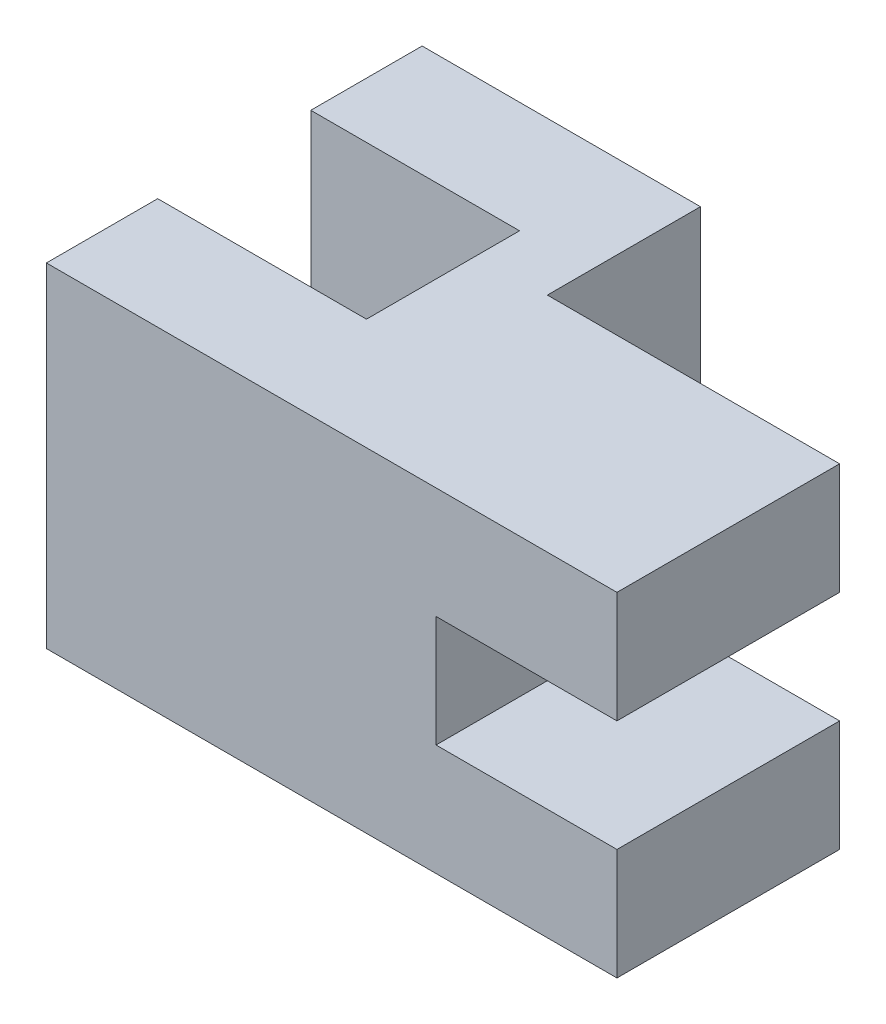
ISO-10303-21;
HEADER;
FILE_DESCRIPTION(('STEP AP214'),'2;1');
FILE_NAME('part.step','',(''),(''),'','','');
FILE_SCHEMA(('AUTOMOTIVE_DESIGN { 1 0 10303 214 1 1 1 1 }'));
ENDSEC;
DATA;
#1=APPLICATION_CONTEXT('core data for automotive mechanical design processes');
#2=APPLICATION_PROTOCOL_DEFINITION('international standard','automotive_design',2000,#1);
#3=PRODUCT_CONTEXT('',#1,'mechanical');
#4=PRODUCT('Part','Part','',(#3));
#5=PRODUCT_RELATED_PRODUCT_CATEGORY('part','',(#4));
#6=PRODUCT_DEFINITION_FORMATION('','',#4);
#7=PRODUCT_DEFINITION_CONTEXT('part definition',#1,'design');
#8=PRODUCT_DEFINITION('design','',#6,#7);
#9=PRODUCT_DEFINITION_SHAPE('','',#8);
#10=(LENGTH_UNIT() NAMED_UNIT(*) SI_UNIT(.MILLI.,.METRE.));
#11=(NAMED_UNIT(*) PLANE_ANGLE_UNIT() SI_UNIT($,.RADIAN.));
#12=(NAMED_UNIT(*) SI_UNIT($,.STERADIAN.) SOLID_ANGLE_UNIT());
#13=UNCERTAINTY_MEASURE_WITH_UNIT(LENGTH_MEASURE(1.E-05),#10,'distance_accuracy_value','');
#14=(GEOMETRIC_REPRESENTATION_CONTEXT(3) GLOBAL_UNCERTAINTY_ASSIGNED_CONTEXT((#13)) GLOBAL_UNIT_ASSIGNED_CONTEXT((#10,
#11,#12)) REPRESENTATION_CONTEXT('',''));
#15=CARTESIAN_POINT('',(0.,0.,0.));
#16=DIRECTION('',(0.,0.,1.));
#17=DIRECTION('',(1.,0.,0.));
#18=AXIS2_PLACEMENT_3D('',#15,#16,#17);
#19=CARTESIAN_POINT('',(26.,12.,8.));
#20=DIRECTION('',(-1.,0.,0.));
#21=DIRECTION('',(0.,0.,1.));
#22=AXIS2_PLACEMENT_3D('',#19,#20,#21);
#23=PLANE('',#22);
#24=DIRECTION('',(0.,-1.,0.));
#25=VECTOR('',#24,1.);
#26=CARTESIAN_POINT('',(26.,12.,-8.));
#27=LINE('',#26,#25);
#28=CARTESIAN_POINT('',(26.,-4.,-8.));
#29=VERTEX_POINT('',#28);
#30=CARTESIAN_POINT('',(26.,-12.,-8.));
#31=VERTEX_POINT('',#30);
#32=EDGE_CURVE('E161',#29,#31,#27,.T.);
#33=ORIENTED_EDGE('',*,*,#32,.F.);
#34=DIRECTION('',(0.,0.,1.));
#35=VECTOR('',#34,1.);
#36=CARTESIAN_POINT('',(26.,-4.,-16.));
#37=LINE('',#36,#35);
#38=CARTESIAN_POINT('',(26.,-4.,8.));
#39=VERTEX_POINT('',#38);
#40=EDGE_CURVE('E177',#29,#39,#37,.T.);
#41=ORIENTED_EDGE('',*,*,#40,.T.);
#42=DIRECTION('',(0.,-1.,0.));
#43=VECTOR('',#42,1.);
#44=CARTESIAN_POINT('',(26.,12.,8.));
#45=LINE('',#44,#43);
#46=CARTESIAN_POINT('',(26.,-12.,8.));
#47=VERTEX_POINT('',#46);
#48=EDGE_CURVE('E212',#39,#47,#45,.T.);
#49=ORIENTED_EDGE('',*,*,#48,.T.);
#50=DIRECTION('',(0.,0.,-1.));
#51=VECTOR('',#50,1.);
#52=CARTESIAN_POINT('',(26.,-12.,8.));
#53=LINE('',#52,#51);
#54=EDGE_CURVE('E193',#47,#31,#53,.T.);
#55=ORIENTED_EDGE('',*,*,#54,.T.);
#56=EDGE_LOOP('',(#33,#41,#49,#55));
#57=FACE_BOUND('',#56,.T.);
#58=ADVANCED_FACE('F45',(#57),#23,.F.);
#59=CARTESIAN_POINT('',(-15.,12.,-19.));
#60=DIRECTION('',(1.,0.,0.));
#61=DIRECTION('',(0.,0.,-1.));
#62=AXIS2_PLACEMENT_3D('',#59,#60,#61);
#63=PLANE('',#62);
#64=DIRECTION('',(0.,0.,1.));
#65=VECTOR('',#64,1.);
#66=CARTESIAN_POINT('',(-15.,-12.,-19.));
#67=LINE('',#66,#65);
#68=CARTESIAN_POINT('',(-15.,-12.,-19.));
#69=VERTEX_POINT('',#68);
#70=CARTESIAN_POINT('',(-15.,-12.,-11.));
#71=VERTEX_POINT('',#70);
#72=EDGE_CURVE('E172',#69,#71,#67,.T.);
#73=ORIENTED_EDGE('',*,*,#72,.T.);
#74=DIRECTION('',(0.,-1.,0.));
#75=VECTOR('',#74,1.);
#76=CARTESIAN_POINT('',(-15.,12.,-11.));
#77=LINE('',#76,#75);
#78=CARTESIAN_POINT('',(-15.,12.,-11.));
#79=VERTEX_POINT('',#78);
#80=EDGE_CURVE('E233',#79,#71,#77,.T.);
#81=ORIENTED_EDGE('',*,*,#80,.F.);
#82=DIRECTION('',(0.,0.,1.));
#83=VECTOR('',#82,1.);
#84=CARTESIAN_POINT('',(-15.,12.,-19.));
#85=LINE('',#84,#83);
#86=CARTESIAN_POINT('',(-15.,12.,-19.));
#87=VERTEX_POINT('',#86);
#88=EDGE_CURVE('E204',#87,#79,#85,.T.);
#89=ORIENTED_EDGE('',*,*,#88,.F.);
#90=DIRECTION('',(0.,-1.,0.));
#91=VECTOR('',#90,1.);
#92=CARTESIAN_POINT('',(-15.,12.,-19.));
#93=LINE('',#92,#91);
#94=EDGE_CURVE('E168',#87,#69,#93,.T.);
#95=ORIENTED_EDGE('',*,*,#94,.T.);
#96=EDGE_LOOP('',(#73,#81,#89,#95));
#97=FACE_BOUND('',#96,.T.);
#98=ADVANCED_FACE('F47',(#97),#63,.F.);
#99=CARTESIAN_POINT('',(-15.,12.,-11.));
#100=DIRECTION('',(0.,0.,-1.));
#101=DIRECTION('',(-1.,0.,0.));
#102=AXIS2_PLACEMENT_3D('',#99,#100,#101);
#103=PLANE('',#102);
#104=DIRECTION('',(1.,0.,0.));
#105=VECTOR('',#104,1.);
#106=CARTESIAN_POINT('',(-15.,-12.,-11.));
#107=LINE('',#106,#105);
#108=CARTESIAN_POINT('',(0.,-12.,-11.));
#109=VERTEX_POINT('',#108);
#110=EDGE_CURVE('E176',#71,#109,#107,.T.);
#111=ORIENTED_EDGE('',*,*,#110,.T.);
#112=DIRECTION('',(0.,-1.,0.));
#113=VECTOR('',#112,1.);
#114=CARTESIAN_POINT('',(0.,12.,-11.));
#115=LINE('',#114,#113);
#116=CARTESIAN_POINT('',(0.,12.,-11.));
#117=VERTEX_POINT('',#116);
#118=EDGE_CURVE('E229',#117,#109,#115,.T.);
#119=ORIENTED_EDGE('',*,*,#118,.F.);
#120=DIRECTION('',(1.,0.,0.));
#121=VECTOR('',#120,1.);
#122=CARTESIAN_POINT('',(-15.,12.,-11.));
#123=LINE('',#122,#121);
#124=EDGE_CURVE('E118',#79,#117,#123,.T.);
#125=ORIENTED_EDGE('',*,*,#124,.F.);
#126=ORIENTED_EDGE('',*,*,#80,.T.);
#127=EDGE_LOOP('',(#111,#119,#125,#126));
#128=FACE_BOUND('',#127,.T.);
#129=ADVANCED_FACE('F328',(#128),#103,.F.);
#130=CARTESIAN_POINT('',(0.,12.,-11.));
#131=DIRECTION('',(1.,0.,0.));
#132=DIRECTION('',(0.,0.,-1.));
#133=AXIS2_PLACEMENT_3D('',#130,#131,#132);
#134=PLANE('',#133);
#135=DIRECTION('',(0.,0.,1.));
#136=VECTOR('',#135,1.);
#137=CARTESIAN_POINT('',(0.,-12.,-11.));
#138=LINE('',#137,#136);
#139=CARTESIAN_POINT('',(0.,-12.,0.));
#140=VERTEX_POINT('',#139);
#141=EDGE_CURVE('E180',#109,#140,#138,.T.);
#142=ORIENTED_EDGE('',*,*,#141,.T.);
#143=DIRECTION('',(0.,-1.,0.));
#144=VECTOR('',#143,1.);
#145=CARTESIAN_POINT('',(0.,12.,0.));
#146=LINE('',#145,#144);
#147=CARTESIAN_POINT('',(0.,12.,0.));
#148=VERTEX_POINT('',#147);
#149=EDGE_CURVE('E225',#148,#140,#146,.T.);
#150=ORIENTED_EDGE('',*,*,#149,.F.);
#151=DIRECTION('',(0.,0.,1.));
#152=VECTOR('',#151,1.);
#153=CARTESIAN_POINT('',(0.,12.,-11.));
#154=LINE('',#153,#152);
#155=EDGE_CURVE('E275',#117,#148,#154,.T.);
#156=ORIENTED_EDGE('',*,*,#155,.F.);
#157=ORIENTED_EDGE('',*,*,#118,.T.);
#158=EDGE_LOOP('',(#142,#150,#156,#157));
#159=FACE_BOUND('',#158,.T.);
#160=ADVANCED_FACE('F331',(#159),#134,.F.);
#161=CARTESIAN_POINT('',(0.,12.,0.));
#162=DIRECTION('',(0.,0.,1.));
#163=DIRECTION('',(1.,0.,0.));
#164=AXIS2_PLACEMENT_3D('',#161,#162,#163);
#165=PLANE('',#164);
#166=DIRECTION('',(-1.,0.,0.));
#167=VECTOR('',#166,1.);
#168=CARTESIAN_POINT('',(0.,-12.,0.));
#169=LINE('',#168,#167);
#170=CARTESIAN_POINT('',(-15.,-12.,0.));
#171=VERTEX_POINT('',#170);
#172=EDGE_CURVE('E183',#140,#171,#169,.T.);
#173=ORIENTED_EDGE('',*,*,#172,.T.);
#174=DIRECTION('',(0.,-1.,0.));
#175=VECTOR('',#174,1.);
#176=CARTESIAN_POINT('',(-15.,12.,0.));
#177=LINE('',#176,#175);
#178=CARTESIAN_POINT('',(-15.,12.,0.));
#179=VERTEX_POINT('',#178);
#180=EDGE_CURVE('E221',#179,#171,#177,.T.);
#181=ORIENTED_EDGE('',*,*,#180,.F.);
#182=DIRECTION('',(-1.,0.,0.));
#183=VECTOR('',#182,1.);
#184=CARTESIAN_POINT('',(0.,12.,0.));
#185=LINE('',#184,#183);
#186=EDGE_CURVE('E278',#148,#179,#185,.T.);
#187=ORIENTED_EDGE('',*,*,#186,.F.);
#188=ORIENTED_EDGE('',*,*,#149,.T.);
#189=EDGE_LOOP('',(#173,#181,#187,#188));
#190=FACE_BOUND('',#189,.T.);
#191=ADVANCED_FACE('F336',(#190),#165,.F.);
#192=CARTESIAN_POINT('',(-15.,12.,0.));
#193=DIRECTION('',(1.,0.,0.));
#194=DIRECTION('',(0.,0.,-1.));
#195=AXIS2_PLACEMENT_3D('',#192,#193,#194);
#196=PLANE('',#195);
#197=DIRECTION('',(0.,0.,1.));
#198=VECTOR('',#197,1.);
#199=CARTESIAN_POINT('',(-15.,-12.,0.));
#200=LINE('',#199,#198);
#201=CARTESIAN_POINT('',(-15.,-12.,8.));
#202=VERTEX_POINT('',#201);
#203=EDGE_CURVE('E186',#171,#202,#200,.T.);
#204=ORIENTED_EDGE('',*,*,#203,.T.);
#205=DIRECTION('',(0.,-1.,0.));
#206=VECTOR('',#205,1.);
#207=CARTESIAN_POINT('',(-15.,12.,8.));
#208=LINE('',#207,#206);
#209=CARTESIAN_POINT('',(-15.,12.,8.));
#210=VERTEX_POINT('',#209);
#211=EDGE_CURVE('E217',#210,#202,#208,.T.);
#212=ORIENTED_EDGE('',*,*,#211,.F.);
#213=DIRECTION('',(0.,0.,1.));
#214=VECTOR('',#213,1.);
#215=CARTESIAN_POINT('',(-15.,12.,0.));
#216=LINE('',#215,#214);
#217=EDGE_CURVE('E281',#179,#210,#216,.T.);
#218=ORIENTED_EDGE('',*,*,#217,.F.);
#219=ORIENTED_EDGE('',*,*,#180,.T.);
#220=EDGE_LOOP('',(#204,#212,#218,#219));
#221=FACE_BOUND('',#220,.T.);
#222=ADVANCED_FACE('F339',(#221),#196,.F.);
#223=CARTESIAN_POINT('',(-15.,12.,8.));
#224=DIRECTION('',(0.,0.,-1.));
#225=DIRECTION('',(-1.,0.,0.));
#226=AXIS2_PLACEMENT_3D('',#223,#224,#225);
#227=PLANE('',#226);
#228=ORIENTED_EDGE('',*,*,#48,.F.);
#229=DIRECTION('',(1.,0.,0.));
#230=VECTOR('',#229,1.);
#231=CARTESIAN_POINT('',(13.,-4.,8.));
#232=LINE('',#231,#230);
#233=CARTESIAN_POINT('',(13.,-4.,8.));
#234=VERTEX_POINT('',#233);
#235=EDGE_CURVE('E270',#234,#39,#232,.T.);
#236=ORIENTED_EDGE('',*,*,#235,.F.);
#237=DIRECTION('',(0.,-1.,0.));
#238=VECTOR('',#237,1.);
#239=CARTESIAN_POINT('',(13.,-4.,8.));
#240=LINE('',#239,#238);
#241=CARTESIAN_POINT('',(13.,4.,8.));
#242=VERTEX_POINT('',#241);
#243=EDGE_CURVE('E253',#242,#234,#240,.T.);
#244=ORIENTED_EDGE('',*,*,#243,.F.);
#245=DIRECTION('',(-1.,0.,0.));
#246=VECTOR('',#245,1.);
#247=CARTESIAN_POINT('',(13.,4.,8.));
#248=LINE('',#247,#246);
#249=CARTESIAN_POINT('',(26.,4.,8.));
#250=VERTEX_POINT('',#249);
#251=EDGE_CURVE('E296',#250,#242,#248,.T.);
#252=ORIENTED_EDGE('',*,*,#251,.F.);
#253=CARTESIAN_POINT('',(26.,12.,8.));
#254=VERTEX_POINT('',#253);
#255=EDGE_CURVE('E213',#254,#250,#45,.T.);
#256=ORIENTED_EDGE('',*,*,#255,.F.);
#257=DIRECTION('',(1.,0.,0.));
#258=VECTOR('',#257,1.);
#259=CARTESIAN_POINT('',(-15.,12.,8.));
#260=LINE('',#259,#258);
#261=EDGE_CURVE('E284',#210,#254,#260,.T.);
#262=ORIENTED_EDGE('',*,*,#261,.F.);
#263=ORIENTED_EDGE('',*,*,#211,.T.);
#264=DIRECTION('',(1.,0.,0.));
#265=VECTOR('',#264,1.);
#266=CARTESIAN_POINT('',(-15.,-12.,8.));
#267=LINE('',#266,#265);
#268=EDGE_CURVE('E189',#202,#47,#267,.T.);
#269=ORIENTED_EDGE('',*,*,#268,.T.);
#270=EDGE_LOOP('',(#228,#236,#244,#252,#256,#262,#263,#269));
#271=FACE_BOUND('',#270,.T.);
#272=ADVANCED_FACE('F294',(#271),#227,.F.);
#273=ORIENTED_EDGE('',*,*,#255,.T.);
#274=DIRECTION('',(0.,0.,1.));
#275=VECTOR('',#274,1.);
#276=CARTESIAN_POINT('',(26.,4.,-16.));
#277=LINE('',#276,#275);
#278=CARTESIAN_POINT('',(26.,4.,-8.));
#279=VERTEX_POINT('',#278);
#280=EDGE_CURVE('E263',#279,#250,#277,.T.);
#281=ORIENTED_EDGE('',*,*,#280,.F.);
#282=CARTESIAN_POINT('',(26.,12.,-8.));
#283=VERTEX_POINT('',#282);
#284=EDGE_CURVE('E209',#283,#279,#27,.T.);
#285=ORIENTED_EDGE('',*,*,#284,.F.);
#286=DIRECTION('',(0.,0.,-1.));
#287=VECTOR('',#286,1.);
#288=CARTESIAN_POINT('',(26.,12.,8.));
#289=LINE('',#288,#287);
#290=EDGE_CURVE('E146',#254,#283,#289,.T.);
#291=ORIENTED_EDGE('',*,*,#290,.F.);
#292=EDGE_LOOP('',(#273,#281,#285,#291));
#293=FACE_BOUND('',#292,.T.);
#294=ADVANCED_FACE('F299',(#293),#23,.F.);
#295=CARTESIAN_POINT('',(5.,12.,-7.99999999999999));
#296=DIRECTION('',(0.,0.,1.));
#297=DIRECTION('',(1.,0.,0.));
#298=AXIS2_PLACEMENT_3D('',#295,#296,#297);
#299=PLANE('',#298);
#300=DIRECTION('',(0.,-1.,0.));
#301=VECTOR('',#300,1.);
#302=CARTESIAN_POINT('',(13.,12.,-7.99999999999999));
#303=LINE('',#302,#301);
#304=CARTESIAN_POINT('',(13.,4.,-7.99999999999999));
#305=VERTEX_POINT('',#304);
#306=CARTESIAN_POINT('',(13.,-4.,-7.99999999999999));
#307=VERTEX_POINT('',#306);
#308=EDGE_CURVE('E54',#305,#307,#303,.T.);
#309=ORIENTED_EDGE('',*,*,#308,.T.);
#310=DIRECTION('',(1.,0.,0.));
#311=VECTOR('',#310,1.);
#312=CARTESIAN_POINT('',(5.,-4.,-7.99999999999999));
#313=LINE('',#312,#311);
#314=EDGE_CURVE('E11',#307,#29,#313,.T.);
#315=ORIENTED_EDGE('',*,*,#314,.T.);
#316=ORIENTED_EDGE('',*,*,#32,.T.);
#317=DIRECTION('',(-1.,0.,0.));
#318=VECTOR('',#317,1.);
#319=CARTESIAN_POINT('',(5.,-12.,-7.99999999999999));
#320=LINE('',#319,#318);
#321=CARTESIAN_POINT('',(5.,-12.,-7.99999999999999));
#322=VERTEX_POINT('',#321);
#323=EDGE_CURVE('E157',#31,#322,#320,.T.);
#324=ORIENTED_EDGE('',*,*,#323,.T.);
#325=DIRECTION('',(0.,-1.,0.));
#326=VECTOR('',#325,1.);
#327=CARTESIAN_POINT('',(5.,12.,-7.99999999999999));
#328=LINE('',#327,#326);
#329=CARTESIAN_POINT('',(5.,12.,-7.99999999999999));
#330=VERTEX_POINT('',#329);
#331=EDGE_CURVE('E153',#330,#322,#328,.T.);
#332=ORIENTED_EDGE('',*,*,#331,.F.);
#333=DIRECTION('',(-1.,0.,0.));
#334=VECTOR('',#333,1.);
#335=CARTESIAN_POINT('',(5.,12.,-7.99999999999999));
#336=LINE('',#335,#334);
#337=EDGE_CURVE('E139',#283,#330,#336,.T.);
#338=ORIENTED_EDGE('',*,*,#337,.F.);
#339=ORIENTED_EDGE('',*,*,#284,.T.);
#340=DIRECTION('',(-1.,0.,0.));
#341=VECTOR('',#340,1.);
#342=CARTESIAN_POINT('',(5.,4.,-7.99999999999999));
#343=LINE('',#342,#341);
#344=EDGE_CURVE('E236',#279,#305,#343,.T.);
#345=ORIENTED_EDGE('',*,*,#344,.T.);
#346=EDGE_LOOP('',(#309,#315,#316,#324,#332,#338,#339,#345));
#347=FACE_BOUND('',#346,.T.);
#348=ADVANCED_FACE('F155',(#347),#299,.F.);
#349=CARTESIAN_POINT('',(5.,12.,-19.));
#350=DIRECTION('',(-1.,0.,0.));
#351=DIRECTION('',(0.,0.,1.));
#352=AXIS2_PLACEMENT_3D('',#349,#350,#351);
#353=PLANE('',#352);
#354=DIRECTION('',(0.,0.,-1.));
#355=VECTOR('',#354,1.);
#356=CARTESIAN_POINT('',(5.,-12.,-19.));
#357=LINE('',#356,#355);
#358=CARTESIAN_POINT('',(5.,-12.,-19.));
#359=VERTEX_POINT('',#358);
#360=EDGE_CURVE('E199',#322,#359,#357,.T.);
#361=ORIENTED_EDGE('',*,*,#360,.T.);
#362=DIRECTION('',(0.,-1.,0.));
#363=VECTOR('',#362,1.);
#364=CARTESIAN_POINT('',(5.,12.,-19.));
#365=LINE('',#364,#363);
#366=CARTESIAN_POINT('',(5.,12.,-19.));
#367=VERTEX_POINT('',#366);
#368=EDGE_CURVE('E162',#367,#359,#365,.T.);
#369=ORIENTED_EDGE('',*,*,#368,.F.);
#370=DIRECTION('',(0.,0.,-1.));
#371=VECTOR('',#370,1.);
#372=CARTESIAN_POINT('',(5.,12.,-19.));
#373=LINE('',#372,#371);
#374=EDGE_CURVE('E143',#330,#367,#373,.T.);
#375=ORIENTED_EDGE('',*,*,#374,.F.);
#376=ORIENTED_EDGE('',*,*,#331,.T.);
#377=EDGE_LOOP('',(#361,#369,#375,#376));
#378=FACE_BOUND('',#377,.T.);
#379=ADVANCED_FACE('F164',(#378),#353,.F.);
#380=CARTESIAN_POINT('',(-15.,12.,-19.));
#381=DIRECTION('',(0.,0.,1.));
#382=DIRECTION('',(1.,0.,0.));
#383=AXIS2_PLACEMENT_3D('',#380,#381,#382);
#384=PLANE('',#383);
#385=DIRECTION('',(-1.,0.,0.));
#386=VECTOR('',#385,1.);
#387=CARTESIAN_POINT('',(-15.,-12.,-19.));
#388=LINE('',#387,#386);
#389=EDGE_CURVE('E109',#359,#69,#388,.T.);
#390=ORIENTED_EDGE('',*,*,#389,.T.);
#391=ORIENTED_EDGE('',*,*,#94,.F.);
#392=DIRECTION('',(-1.,0.,0.));
#393=VECTOR('',#392,1.);
#394=CARTESIAN_POINT('',(-15.,12.,-19.));
#395=LINE('',#394,#393);
#396=EDGE_CURVE('E70',#367,#87,#395,.T.);
#397=ORIENTED_EDGE('',*,*,#396,.F.);
#398=ORIENTED_EDGE('',*,*,#368,.T.);
#399=EDGE_LOOP('',(#390,#391,#397,#398));
#400=FACE_BOUND('',#399,.T.);
#401=ADVANCED_FACE('F322',(#400),#384,.F.);
#402=CARTESIAN_POINT('',(0.,12.,0.));
#403=DIRECTION('',(0.,1.,0.));
#404=DIRECTION('',(0.,0.,1.));
#405=AXIS2_PLACEMENT_3D('',#402,#403,#404);
#406=PLANE('',#405);
#407=ORIENTED_EDGE('',*,*,#88,.T.);
#408=ORIENTED_EDGE('',*,*,#124,.T.);
#409=ORIENTED_EDGE('',*,*,#155,.T.);
#410=ORIENTED_EDGE('',*,*,#186,.T.);
#411=ORIENTED_EDGE('',*,*,#217,.T.);
#412=ORIENTED_EDGE('',*,*,#261,.T.);
#413=ORIENTED_EDGE('',*,*,#290,.T.);
#414=ORIENTED_EDGE('',*,*,#337,.T.);
#415=ORIENTED_EDGE('',*,*,#374,.T.);
#416=ORIENTED_EDGE('',*,*,#396,.T.);
#417=EDGE_LOOP('',(#407,#408,#409,#410,#411,#412,#413,#414,#415,#416));
#418=FACE_BOUND('',#417,.T.);
#419=ADVANCED_FACE('F141',(#418),#406,.T.);
#420=CARTESIAN_POINT('',(0.,-12.,0.));
#421=DIRECTION('',(0.,1.,0.));
#422=DIRECTION('',(0.,0.,1.));
#423=AXIS2_PLACEMENT_3D('',#420,#421,#422);
#424=PLANE('',#423);
#425=ORIENTED_EDGE('',*,*,#72,.F.);
#426=ORIENTED_EDGE('',*,*,#389,.F.);
#427=ORIENTED_EDGE('',*,*,#360,.F.);
#428=ORIENTED_EDGE('',*,*,#323,.F.);
#429=ORIENTED_EDGE('',*,*,#54,.F.);
#430=ORIENTED_EDGE('',*,*,#268,.F.);
#431=ORIENTED_EDGE('',*,*,#203,.F.);
#432=ORIENTED_EDGE('',*,*,#172,.F.);
#433=ORIENTED_EDGE('',*,*,#141,.F.);
#434=ORIENTED_EDGE('',*,*,#110,.F.);
#435=EDGE_LOOP('',(#425,#426,#427,#428,#429,#430,#431,#432,#433,#434));
#436=FACE_BOUND('',#435,.T.);
#437=ADVANCED_FACE('F321',(#436),#424,.F.);
#438=CARTESIAN_POINT('',(13.,-4.,-16.));
#439=DIRECTION('',(0.,-1.,0.));
#440=DIRECTION('',(0.,0.,-1.));
#441=AXIS2_PLACEMENT_3D('',#438,#439,#440);
#442=PLANE('',#441);
#443=DIRECTION('',(0.,0.,1.));
#444=VECTOR('',#443,1.);
#445=CARTESIAN_POINT('',(13.,-4.,-16.));
#446=LINE('',#445,#444);
#447=EDGE_CURVE('E250',#307,#234,#446,.T.);
#448=ORIENTED_EDGE('',*,*,#447,.T.);
#449=ORIENTED_EDGE('',*,*,#235,.T.);
#450=ORIENTED_EDGE('',*,*,#40,.F.);
#451=ORIENTED_EDGE('',*,*,#314,.F.);
#452=EDGE_LOOP('',(#448,#449,#450,#451));
#453=FACE_BOUND('',#452,.T.);
#454=ADVANCED_FACE('F313',(#453),#442,.F.);
#455=CARTESIAN_POINT('',(13.,-4.,-16.));
#456=DIRECTION('',(-1.,0.,0.));
#457=DIRECTION('',(0.,0.,1.));
#458=AXIS2_PLACEMENT_3D('',#455,#456,#457);
#459=PLANE('',#458);
#460=DIRECTION('',(0.,0.,1.));
#461=VECTOR('',#460,1.);
#462=CARTESIAN_POINT('',(13.,4.,-16.));
#463=LINE('',#462,#461);
#464=EDGE_CURVE('E61',#305,#242,#463,.T.);
#465=ORIENTED_EDGE('',*,*,#464,.T.);
#466=ORIENTED_EDGE('',*,*,#243,.T.);
#467=ORIENTED_EDGE('',*,*,#447,.F.);
#468=ORIENTED_EDGE('',*,*,#308,.F.);
#469=EDGE_LOOP('',(#465,#466,#467,#468));
#470=FACE_BOUND('',#469,.T.);
#471=ADVANCED_FACE('F246',(#470),#459,.F.);
#472=CARTESIAN_POINT('',(13.,4.,-16.));
#473=DIRECTION('',(0.,1.,0.));
#474=DIRECTION('',(0.,0.,1.));
#475=AXIS2_PLACEMENT_3D('',#472,#473,#474);
#476=PLANE('',#475);
#477=ORIENTED_EDGE('',*,*,#280,.T.);
#478=ORIENTED_EDGE('',*,*,#251,.T.);
#479=ORIENTED_EDGE('',*,*,#464,.F.);
#480=ORIENTED_EDGE('',*,*,#344,.F.);
#481=EDGE_LOOP('',(#477,#478,#479,#480));
#482=FACE_BOUND('',#481,.T.);
#483=ADVANCED_FACE('F306',(#482),#476,.F.);
#484=CLOSED_SHELL('',(#58,#98,#129,#160,#191,#222,#272,#294,#348,#379,#401,#419,#437,#454,#471,#483));
#485=MANIFOLD_SOLID_BREP('B2',#484);
#486=ADVANCED_BREP_SHAPE_REPRESENTATION('',(#18,#485),#14);
#487=SHAPE_DEFINITION_REPRESENTATION(#9,#486);
ENDSEC;
END-ISO-10303-21;
